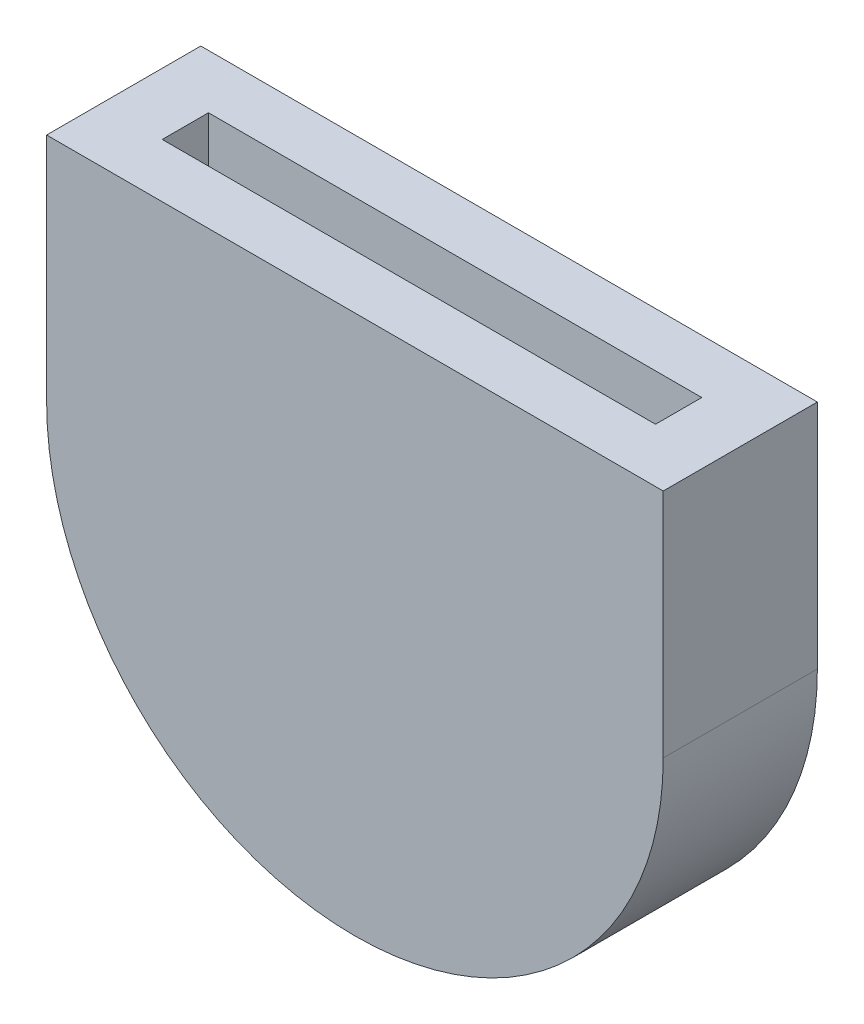
ISO-10303-21;
HEADER;
FILE_DESCRIPTION(('STEP AP214'),'2;1');
FILE_NAME('part.step','',(''),(''),'','','');
FILE_SCHEMA(('AUTOMOTIVE_DESIGN { 1 0 10303 214 1 1 1 1 }'));
ENDSEC;
DATA;
#1=APPLICATION_CONTEXT('core data for automotive mechanical design processes');
#2=APPLICATION_PROTOCOL_DEFINITION('international standard','automotive_design',2000,#1);
#3=PRODUCT_CONTEXT('',#1,'mechanical');
#4=PRODUCT('Part','Part','',(#3));
#5=PRODUCT_RELATED_PRODUCT_CATEGORY('part','',(#4));
#6=PRODUCT_DEFINITION_FORMATION('','',#4);
#7=PRODUCT_DEFINITION_CONTEXT('part definition',#1,'design');
#8=PRODUCT_DEFINITION('design','',#6,#7);
#9=PRODUCT_DEFINITION_SHAPE('','',#8);
#10=(LENGTH_UNIT() NAMED_UNIT(*) SI_UNIT(.MILLI.,.METRE.));
#11=(NAMED_UNIT(*) PLANE_ANGLE_UNIT() SI_UNIT($,.RADIAN.));
#12=(NAMED_UNIT(*) SI_UNIT($,.STERADIAN.) SOLID_ANGLE_UNIT());
#13=UNCERTAINTY_MEASURE_WITH_UNIT(LENGTH_MEASURE(1.E-05),#10,'distance_accuracy_value','');
#14=(GEOMETRIC_REPRESENTATION_CONTEXT(3) GLOBAL_UNCERTAINTY_ASSIGNED_CONTEXT((#13)) GLOBAL_UNIT_ASSIGNED_CONTEXT((#10,
#11,#12)) REPRESENTATION_CONTEXT('',''));
#15=CARTESIAN_POINT('',(0.,0.,0.));
#16=DIRECTION('',(0.,0.,1.));
#17=DIRECTION('',(1.,0.,0.));
#18=AXIS2_PLACEMENT_3D('',#15,#16,#17);
#19=CARTESIAN_POINT('',(-20.,15.,5.));
#20=DIRECTION('',(0.,-1.,0.));
#21=DIRECTION('',(0.,0.,-1.));
#22=AXIS2_PLACEMENT_3D('',#19,#20,#21);
#23=PLANE('',#22);
#24=DIRECTION('',(-1.,0.,0.));
#25=VECTOR('',#24,1.);
#26=CARTESIAN_POINT('',(-20.,15.,-5.));
#27=LINE('',#26,#25);
#28=CARTESIAN_POINT('',(20.,15.,-5.));
#29=VERTEX_POINT('',#28);
#30=CARTESIAN_POINT('',(-20.,15.,-5.));
#31=VERTEX_POINT('',#30);
#32=EDGE_CURVE('E161',#29,#31,#27,.T.);
#33=ORIENTED_EDGE('',*,*,#32,.T.);
#34=DIRECTION('',(0.,0.,-1.));
#35=VECTOR('',#34,1.);
#36=CARTESIAN_POINT('',(-20.,15.,5.));
#37=LINE('',#36,#35);
#38=CARTESIAN_POINT('',(-20.,15.,5.));
#39=VERTEX_POINT('',#38);
#40=EDGE_CURVE('E165',#39,#31,#37,.T.);
#41=ORIENTED_EDGE('',*,*,#40,.F.);
#42=DIRECTION('',(-1.,0.,0.));
#43=VECTOR('',#42,1.);
#44=CARTESIAN_POINT('',(-20.,15.,5.));
#45=LINE('',#44,#43);
#46=CARTESIAN_POINT('',(20.,15.,5.));
#47=VERTEX_POINT('',#46);
#48=EDGE_CURVE('E153',#47,#39,#45,.T.);
#49=ORIENTED_EDGE('',*,*,#48,.F.);
#50=DIRECTION('',(0.,0.,-1.));
#51=VECTOR('',#50,1.);
#52=CARTESIAN_POINT('',(20.,15.,5.));
#53=LINE('',#52,#51);
#54=EDGE_CURVE('E43',#47,#29,#53,.T.);
#55=ORIENTED_EDGE('',*,*,#54,.T.);
#56=EDGE_LOOP('',(#33,#41,#49,#55));
#57=FACE_BOUND('',#56,.T.);
#58=DIRECTION('',(-1.,0.,0.));
#59=VECTOR('',#58,1.);
#60=CARTESIAN_POINT('',(-16.,15.,-1.5));
#61=LINE('',#60,#59);
#62=CARTESIAN_POINT('',(16.,15.,-1.5));
#63=VERTEX_POINT('',#62);
#64=CARTESIAN_POINT('',(-16.,15.,-1.5));
#65=VERTEX_POINT('',#64);
#66=EDGE_CURVE('E129',#63,#65,#61,.T.);
#67=ORIENTED_EDGE('',*,*,#66,.F.);
#68=DIRECTION('',(0.,0.,1.));
#69=VECTOR('',#68,1.);
#70=CARTESIAN_POINT('',(16.,15.,-1.5));
#71=LINE('',#70,#69);
#72=CARTESIAN_POINT('',(16.,15.,1.5));
#73=VERTEX_POINT('',#72);
#74=EDGE_CURVE('E120',#63,#73,#71,.T.);
#75=ORIENTED_EDGE('',*,*,#74,.T.);
#76=DIRECTION('',(-1.,0.,0.));
#77=VECTOR('',#76,1.);
#78=CARTESIAN_POINT('',(-16.,15.,1.5));
#79=LINE('',#78,#77);
#80=CARTESIAN_POINT('',(-16.,15.,1.5));
#81=VERTEX_POINT('',#80);
#82=EDGE_CURVE('E134',#73,#81,#79,.T.);
#83=ORIENTED_EDGE('',*,*,#82,.T.);
#84=DIRECTION('',(0.,0.,1.));
#85=VECTOR('',#84,1.);
#86=CARTESIAN_POINT('',(-16.,15.,-1.5));
#87=LINE('',#86,#85);
#88=EDGE_CURVE('E147',#65,#81,#87,.T.);
#89=ORIENTED_EDGE('',*,*,#88,.F.);
#90=EDGE_LOOP('',(#67,#75,#83,#89));
#91=FACE_BOUND('',#90,.T.);
#92=ADVANCED_FACE('F35',(#57,#91),#23,.F.);
#93=CARTESIAN_POINT('',(0.,0.,5.));
#94=DIRECTION('',(0.,0.,-1.));
#95=DIRECTION('',(-1.,0.,0.));
#96=AXIS2_PLACEMENT_3D('',#93,#94,#95);
#97=CYLINDRICAL_SURFACE('',#96,20.);
#98=CARTESIAN_POINT('',(0.,0.,-5.));
#99=DIRECTION('',(0.,0.,1.));
#100=DIRECTION('',(1.,0.,0.));
#101=AXIS2_PLACEMENT_3D('',#98,#99,#100);
#102=CIRCLE('',#101,20.);
#103=CARTESIAN_POINT('',(-20.,0.,-5.));
#104=VERTEX_POINT('',#103);
#105=CARTESIAN_POINT('',(20.,0.,-5.));
#106=VERTEX_POINT('',#105);
#107=EDGE_CURVE('E146',#104,#106,#102,.T.);
#108=ORIENTED_EDGE('',*,*,#107,.T.);
#109=DIRECTION('',(0.,0.,-1.));
#110=VECTOR('',#109,1.);
#111=CARTESIAN_POINT('',(20.,0.,5.));
#112=LINE('',#111,#110);
#113=CARTESIAN_POINT('',(20.,0.,5.));
#114=VERTEX_POINT('',#113);
#115=EDGE_CURVE('E11',#114,#106,#112,.T.);
#116=ORIENTED_EDGE('',*,*,#115,.F.);
#117=CARTESIAN_POINT('',(0.,0.,5.));
#118=DIRECTION('',(0.,0.,1.));
#119=DIRECTION('',(1.,0.,0.));
#120=AXIS2_PLACEMENT_3D('',#117,#118,#119);
#121=CIRCLE('',#120,20.);
#122=CARTESIAN_POINT('',(-20.,0.,5.));
#123=VERTEX_POINT('',#122);
#124=EDGE_CURVE('E150',#123,#114,#121,.T.);
#125=ORIENTED_EDGE('',*,*,#124,.F.);
#126=DIRECTION('',(0.,0.,-1.));
#127=VECTOR('',#126,1.);
#128=CARTESIAN_POINT('',(-20.,0.,5.));
#129=LINE('',#128,#127);
#130=EDGE_CURVE('E156',#123,#104,#129,.T.);
#131=ORIENTED_EDGE('',*,*,#130,.T.);
#132=EDGE_LOOP('',(#108,#116,#125,#131));
#133=FACE_BOUND('',#132,.T.);
#134=ADVANCED_FACE('F37',(#133),#97,.T.);
#135=CARTESIAN_POINT('',(20.,15.,5.));
#136=DIRECTION('',(-1.,0.,0.));
#137=DIRECTION('',(0.,-1.,0.));
#138=AXIS2_PLACEMENT_3D('',#135,#136,#137);
#139=PLANE('',#138);
#140=DIRECTION('',(0.,1.,0.));
#141=VECTOR('',#140,1.);
#142=CARTESIAN_POINT('',(20.,15.,-5.));
#143=LINE('',#142,#141);
#144=EDGE_CURVE('E159',#106,#29,#143,.T.);
#145=ORIENTED_EDGE('',*,*,#144,.T.);
#146=ORIENTED_EDGE('',*,*,#54,.F.);
#147=DIRECTION('',(0.,1.,0.));
#148=VECTOR('',#147,1.);
#149=CARTESIAN_POINT('',(20.,15.,5.));
#150=LINE('',#149,#148);
#151=EDGE_CURVE('E87',#114,#47,#150,.T.);
#152=ORIENTED_EDGE('',*,*,#151,.F.);
#153=ORIENTED_EDGE('',*,*,#115,.T.);
#154=EDGE_LOOP('',(#145,#146,#152,#153));
#155=FACE_BOUND('',#154,.T.);
#156=ADVANCED_FACE('F181',(#155),#139,.F.);
#157=CARTESIAN_POINT('',(-20.,0.,5.));
#158=DIRECTION('',(1.,0.,0.));
#159=DIRECTION('',(0.,1.,0.));
#160=AXIS2_PLACEMENT_3D('',#157,#158,#159);
#161=PLANE('',#160);
#162=DIRECTION('',(0.,-1.,0.));
#163=VECTOR('',#162,1.);
#164=CARTESIAN_POINT('',(-20.,0.,-5.));
#165=LINE('',#164,#163);
#166=EDGE_CURVE('E80',#31,#104,#165,.T.);
#167=ORIENTED_EDGE('',*,*,#166,.T.);
#168=ORIENTED_EDGE('',*,*,#130,.F.);
#169=DIRECTION('',(0.,-1.,0.));
#170=VECTOR('',#169,1.);
#171=CARTESIAN_POINT('',(-20.,0.,5.));
#172=LINE('',#171,#170);
#173=EDGE_CURVE('E59',#39,#123,#172,.T.);
#174=ORIENTED_EDGE('',*,*,#173,.F.);
#175=ORIENTED_EDGE('',*,*,#40,.T.);
#176=EDGE_LOOP('',(#167,#168,#174,#175));
#177=FACE_BOUND('',#176,.T.);
#178=ADVANCED_FACE('F178',(#177),#161,.F.);
#179=CARTESIAN_POINT('',(0.,0.,5.));
#180=DIRECTION('',(0.,0.,1.));
#181=DIRECTION('',(1.,0.,0.));
#182=AXIS2_PLACEMENT_3D('',#179,#180,#181);
#183=PLANE('',#182);
#184=ORIENTED_EDGE('',*,*,#124,.T.);
#185=ORIENTED_EDGE('',*,*,#151,.T.);
#186=ORIENTED_EDGE('',*,*,#48,.T.);
#187=ORIENTED_EDGE('',*,*,#173,.T.);
#188=EDGE_LOOP('',(#184,#185,#186,#187));
#189=FACE_BOUND('',#188,.T.);
#190=ADVANCED_FACE('F180',(#189),#183,.T.);
#191=CARTESIAN_POINT('',(0.,0.,-5.));
#192=DIRECTION('',(0.,0.,1.));
#193=DIRECTION('',(1.,0.,0.));
#194=AXIS2_PLACEMENT_3D('',#191,#192,#193);
#195=PLANE('',#194);
#196=ORIENTED_EDGE('',*,*,#107,.F.);
#197=ORIENTED_EDGE('',*,*,#166,.F.);
#198=ORIENTED_EDGE('',*,*,#32,.F.);
#199=ORIENTED_EDGE('',*,*,#144,.F.);
#200=EDGE_LOOP('',(#196,#197,#198,#199));
#201=FACE_BOUND('',#200,.T.);
#202=ADVANCED_FACE('F174',(#201),#195,.F.);
#203=CARTESIAN_POINT('',(0.,0.,-1.5));
#204=DIRECTION('',(0.,0.,1.));
#205=DIRECTION('',(1.,0.,0.));
#206=AXIS2_PLACEMENT_3D('',#203,#204,#205);
#207=CYLINDRICAL_SURFACE('',#206,16.);
#208=CARTESIAN_POINT('',(0.,0.,1.5));
#209=DIRECTION('',(0.,0.,1.));
#210=DIRECTION('',(1.,0.,0.));
#211=AXIS2_PLACEMENT_3D('',#208,#209,#210);
#212=CIRCLE('',#211,16.);
#213=CARTESIAN_POINT('',(-16.,0.,1.5));
#214=VERTEX_POINT('',#213);
#215=CARTESIAN_POINT('',(16.,0.,1.5));
#216=VERTEX_POINT('',#215);
#217=EDGE_CURVE('E116',#214,#216,#212,.T.);
#218=ORIENTED_EDGE('',*,*,#217,.T.);
#219=DIRECTION('',(0.,0.,1.));
#220=VECTOR('',#219,1.);
#221=CARTESIAN_POINT('',(16.,0.,-1.5));
#222=LINE('',#221,#220);
#223=CARTESIAN_POINT('',(16.,0.,-1.5));
#224=VERTEX_POINT('',#223);
#225=EDGE_CURVE('E110',#224,#216,#222,.T.);
#226=ORIENTED_EDGE('',*,*,#225,.F.);
#227=CARTESIAN_POINT('',(0.,0.,-1.5));
#228=DIRECTION('',(0.,0.,1.));
#229=DIRECTION('',(1.,0.,0.));
#230=AXIS2_PLACEMENT_3D('',#227,#228,#229);
#231=CIRCLE('',#230,16.);
#232=CARTESIAN_POINT('',(-16.,0.,-1.5));
#233=VERTEX_POINT('',#232);
#234=EDGE_CURVE('E114',#233,#224,#231,.T.);
#235=ORIENTED_EDGE('',*,*,#234,.F.);
#236=DIRECTION('',(0.,0.,1.));
#237=VECTOR('',#236,1.);
#238=CARTESIAN_POINT('',(-16.,0.,-1.5));
#239=LINE('',#238,#237);
#240=EDGE_CURVE('E144',#233,#214,#239,.T.);
#241=ORIENTED_EDGE('',*,*,#240,.T.);
#242=EDGE_LOOP('',(#218,#226,#235,#241));
#243=FACE_BOUND('',#242,.T.);
#244=ADVANCED_FACE('F112',(#243),#207,.F.);
#245=CARTESIAN_POINT('',(-16.,0.,-1.5));
#246=DIRECTION('',(-1.,0.,0.));
#247=DIRECTION('',(0.,0.,1.));
#248=AXIS2_PLACEMENT_3D('',#245,#246,#247);
#249=PLANE('',#248);
#250=DIRECTION('',(0.,-1.,0.));
#251=VECTOR('',#250,1.);
#252=CARTESIAN_POINT('',(-16.,0.,1.5));
#253=LINE('',#252,#251);
#254=EDGE_CURVE('E50',#81,#214,#253,.T.);
#255=ORIENTED_EDGE('',*,*,#254,.T.);
#256=ORIENTED_EDGE('',*,*,#240,.F.);
#257=DIRECTION('',(0.,-1.,0.));
#258=VECTOR('',#257,1.);
#259=CARTESIAN_POINT('',(-16.,0.,-1.5));
#260=LINE('',#259,#258);
#261=EDGE_CURVE('E121',#65,#233,#260,.T.);
#262=ORIENTED_EDGE('',*,*,#261,.F.);
#263=ORIENTED_EDGE('',*,*,#88,.T.);
#264=EDGE_LOOP('',(#255,#256,#262,#263));
#265=FACE_BOUND('',#264,.T.);
#266=ADVANCED_FACE('F230',(#265),#249,.F.);
#267=CARTESIAN_POINT('',(16.,0.,-1.5));
#268=DIRECTION('',(1.,0.,0.));
#269=DIRECTION('',(0.,0.,-1.));
#270=AXIS2_PLACEMENT_3D('',#267,#268,#269);
#271=PLANE('',#270);
#272=DIRECTION('',(0.,1.,0.));
#273=VECTOR('',#272,1.);
#274=CARTESIAN_POINT('',(16.,0.,1.5));
#275=LINE('',#274,#273);
#276=EDGE_CURVE('E140',#216,#73,#275,.T.);
#277=ORIENTED_EDGE('',*,*,#276,.T.);
#278=ORIENTED_EDGE('',*,*,#74,.F.);
#279=DIRECTION('',(0.,1.,0.));
#280=VECTOR('',#279,1.);
#281=CARTESIAN_POINT('',(16.,0.,-1.5));
#282=LINE('',#281,#280);
#283=EDGE_CURVE('E124',#224,#63,#282,.T.);
#284=ORIENTED_EDGE('',*,*,#283,.F.);
#285=ORIENTED_EDGE('',*,*,#225,.T.);
#286=EDGE_LOOP('',(#277,#278,#284,#285));
#287=FACE_BOUND('',#286,.T.);
#288=ADVANCED_FACE('F125',(#287),#271,.F.);
#289=CARTESIAN_POINT('',(0.,0.,-1.5));
#290=DIRECTION('',(0.,0.,1.));
#291=DIRECTION('',(1.,0.,0.));
#292=AXIS2_PLACEMENT_3D('',#289,#290,#291);
#293=PLANE('',#292);
#294=ORIENTED_EDGE('',*,*,#234,.T.);
#295=ORIENTED_EDGE('',*,*,#283,.T.);
#296=ORIENTED_EDGE('',*,*,#66,.T.);
#297=ORIENTED_EDGE('',*,*,#261,.T.);
#298=EDGE_LOOP('',(#294,#295,#296,#297));
#299=FACE_BOUND('',#298,.T.);
#300=ADVANCED_FACE('F131',(#299),#293,.T.);
#301=CARTESIAN_POINT('',(0.,0.,1.5));
#302=DIRECTION('',(0.,0.,1.));
#303=DIRECTION('',(1.,0.,0.));
#304=AXIS2_PLACEMENT_3D('',#301,#302,#303);
#305=PLANE('',#304);
#306=ORIENTED_EDGE('',*,*,#217,.F.);
#307=ORIENTED_EDGE('',*,*,#254,.F.);
#308=ORIENTED_EDGE('',*,*,#82,.F.);
#309=ORIENTED_EDGE('',*,*,#276,.F.);
#310=EDGE_LOOP('',(#306,#307,#308,#309));
#311=FACE_BOUND('',#310,.T.);
#312=ADVANCED_FACE('F256',(#311),#305,.F.);
#313=CLOSED_SHELL('',(#92,#134,#156,#178,#190,#202,#244,#266,#288,#300,#312));
#314=MANIFOLD_SOLID_BREP('B2',#313);
#315=ADVANCED_BREP_SHAPE_REPRESENTATION('',(#18,#314),#14);
#316=SHAPE_DEFINITION_REPRESENTATION(#9,#315);
ENDSEC;
END-ISO-10303-21;
